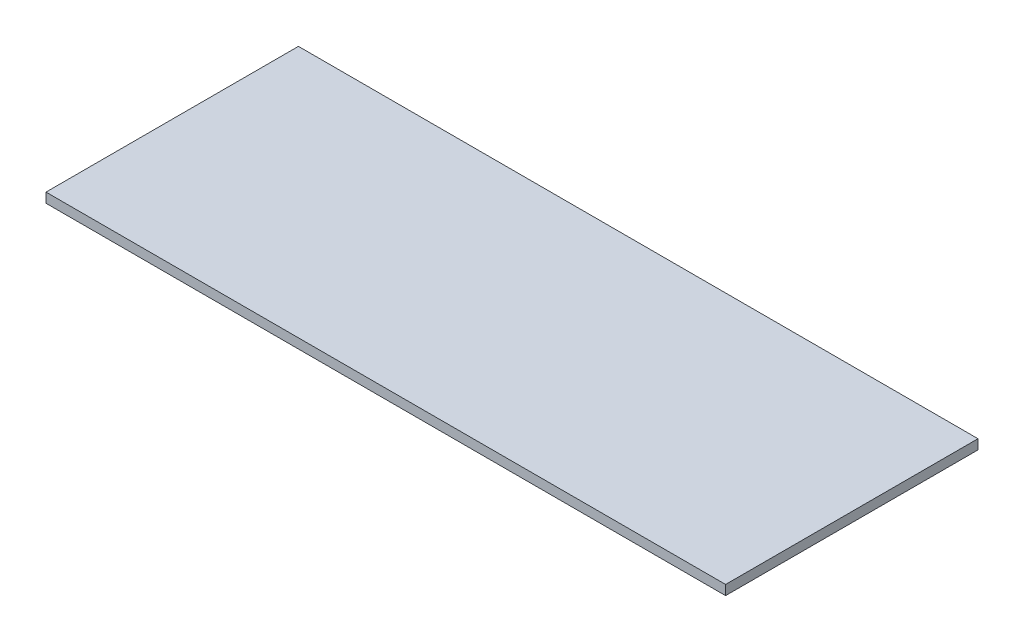
ISO-10303-21;
HEADER;
FILE_DESCRIPTION(('STEP AP214'),'2;1');
FILE_NAME('part.step','',(''),(''),'','','');
FILE_SCHEMA(('AUTOMOTIVE_DESIGN { 1 0 10303 214 1 1 1 1 }'));
ENDSEC;
DATA;
#1=APPLICATION_CONTEXT('core data for automotive mechanical design processes');
#2=APPLICATION_PROTOCOL_DEFINITION('international standard','automotive_design',2000,#1);
#3=PRODUCT_CONTEXT('',#1,'mechanical');
#4=PRODUCT('Part','Part','',(#3));
#5=PRODUCT_RELATED_PRODUCT_CATEGORY('part','',(#4));
#6=PRODUCT_DEFINITION_FORMATION('','',#4);
#7=PRODUCT_DEFINITION_CONTEXT('part definition',#1,'design');
#8=PRODUCT_DEFINITION('design','',#6,#7);
#9=PRODUCT_DEFINITION_SHAPE('','',#8);
#10=(LENGTH_UNIT() NAMED_UNIT(*) SI_UNIT(.MILLI.,.METRE.));
#11=(NAMED_UNIT(*) PLANE_ANGLE_UNIT() SI_UNIT($,.RADIAN.));
#12=(NAMED_UNIT(*) SI_UNIT($,.STERADIAN.) SOLID_ANGLE_UNIT());
#13=UNCERTAINTY_MEASURE_WITH_UNIT(LENGTH_MEASURE(1.E-05),#10,'distance_accuracy_value','');
#14=(GEOMETRIC_REPRESENTATION_CONTEXT(3) GLOBAL_UNCERTAINTY_ASSIGNED_CONTEXT((#13)) GLOBAL_UNIT_ASSIGNED_CONTEXT((#10,
#11,#12)) REPRESENTATION_CONTEXT('',''));
#15=CARTESIAN_POINT('',(0.,0.,0.));
#16=DIRECTION('',(0.,0.,1.));
#17=DIRECTION('',(1.,0.,0.));
#18=AXIS2_PLACEMENT_3D('',#15,#16,#17);
#19=CARTESIAN_POINT('',(175.,5.,-65.));
#20=DIRECTION('',(-1.,0.,0.));
#21=DIRECTION('',(0.,0.,1.));
#22=AXIS2_PLACEMENT_3D('',#19,#20,#21);
#23=PLANE('',#22);
#24=DIRECTION('',(0.,0.,-1.));
#25=VECTOR('',#24,1.);
#26=CARTESIAN_POINT('',(175.,0.,-65.));
#27=LINE('',#26,#25);
#28=CARTESIAN_POINT('',(175.,0.,65.));
#29=VERTEX_POINT('',#28);
#30=CARTESIAN_POINT('',(175.,0.,-65.));
#31=VERTEX_POINT('',#30);
#32=EDGE_CURVE('E96',#29,#31,#27,.T.);
#33=ORIENTED_EDGE('',*,*,#32,.T.);
#34=DIRECTION('',(0.,-1.,0.));
#35=VECTOR('',#34,1.);
#36=CARTESIAN_POINT('',(175.,5.,-65.));
#37=LINE('',#36,#35);
#38=CARTESIAN_POINT('',(175.,5.,-65.));
#39=VERTEX_POINT('',#38);
#40=EDGE_CURVE('E11',#39,#31,#37,.T.);
#41=ORIENTED_EDGE('',*,*,#40,.F.);
#42=DIRECTION('',(0.,0.,-1.));
#43=VECTOR('',#42,1.);
#44=CARTESIAN_POINT('',(175.,5.,-65.));
#45=LINE('',#44,#43);
#46=CARTESIAN_POINT('',(175.,5.,65.));
#47=VERTEX_POINT('',#46);
#48=EDGE_CURVE('E84',#47,#39,#45,.T.);
#49=ORIENTED_EDGE('',*,*,#48,.F.);
#50=DIRECTION('',(0.,-1.,0.));
#51=VECTOR('',#50,1.);
#52=CARTESIAN_POINT('',(175.,5.,65.));
#53=LINE('',#52,#51);
#54=EDGE_CURVE('E92',#47,#29,#53,.T.);
#55=ORIENTED_EDGE('',*,*,#54,.T.);
#56=EDGE_LOOP('',(#33,#41,#49,#55));
#57=FACE_BOUND('',#56,.T.);
#58=ADVANCED_FACE('F33',(#57),#23,.F.);
#59=CARTESIAN_POINT('',(-175.,5.,-65.));
#60=DIRECTION('',(0.,0.,1.));
#61=DIRECTION('',(1.,0.,0.));
#62=AXIS2_PLACEMENT_3D('',#59,#60,#61);
#63=PLANE('',#62);
#64=DIRECTION('',(-1.,0.,0.));
#65=VECTOR('',#64,1.);
#66=CARTESIAN_POINT('',(-175.,0.,-65.));
#67=LINE('',#66,#65);
#68=CARTESIAN_POINT('',(-175.,0.,-65.));
#69=VERTEX_POINT('',#68);
#70=EDGE_CURVE('E88',#31,#69,#67,.T.);
#71=ORIENTED_EDGE('',*,*,#70,.T.);
#72=DIRECTION('',(0.,-1.,0.));
#73=VECTOR('',#72,1.);
#74=CARTESIAN_POINT('',(-175.,5.,-65.));
#75=LINE('',#74,#73);
#76=CARTESIAN_POINT('',(-175.,5.,-65.));
#77=VERTEX_POINT('',#76);
#78=EDGE_CURVE('E41',#77,#69,#75,.T.);
#79=ORIENTED_EDGE('',*,*,#78,.F.);
#80=DIRECTION('',(-1.,0.,0.));
#81=VECTOR('',#80,1.);
#82=CARTESIAN_POINT('',(-175.,5.,-65.));
#83=LINE('',#82,#81);
#84=EDGE_CURVE('E79',#39,#77,#83,.T.);
#85=ORIENTED_EDGE('',*,*,#84,.F.);
#86=ORIENTED_EDGE('',*,*,#40,.T.);
#87=EDGE_LOOP('',(#71,#79,#85,#86));
#88=FACE_BOUND('',#87,.T.);
#89=ADVANCED_FACE('F87',(#88),#63,.F.);
#90=CARTESIAN_POINT('',(-175.,5.,-65.));
#91=DIRECTION('',(1.,0.,0.));
#92=DIRECTION('',(0.,0.,-1.));
#93=AXIS2_PLACEMENT_3D('',#90,#91,#92);
#94=PLANE('',#93);
#95=DIRECTION('',(0.,0.,1.));
#96=VECTOR('',#95,1.);
#97=CARTESIAN_POINT('',(-175.,0.,-65.));
#98=LINE('',#97,#96);
#99=CARTESIAN_POINT('',(-175.,0.,65.));
#100=VERTEX_POINT('',#99);
#101=EDGE_CURVE('E66',#69,#100,#98,.T.);
#102=ORIENTED_EDGE('',*,*,#101,.T.);
#103=DIRECTION('',(0.,-1.,0.));
#104=VECTOR('',#103,1.);
#105=CARTESIAN_POINT('',(-175.,5.,65.));
#106=LINE('',#105,#104);
#107=CARTESIAN_POINT('',(-175.,5.,65.));
#108=VERTEX_POINT('',#107);
#109=EDGE_CURVE('E89',#108,#100,#106,.T.);
#110=ORIENTED_EDGE('',*,*,#109,.F.);
#111=DIRECTION('',(0.,0.,1.));
#112=VECTOR('',#111,1.);
#113=CARTESIAN_POINT('',(-175.,5.,-65.));
#114=LINE('',#113,#112);
#115=EDGE_CURVE('E82',#77,#108,#114,.T.);
#116=ORIENTED_EDGE('',*,*,#115,.F.);
#117=ORIENTED_EDGE('',*,*,#78,.T.);
#118=EDGE_LOOP('',(#102,#110,#116,#117));
#119=FACE_BOUND('',#118,.T.);
#120=ADVANCED_FACE('F90',(#119),#94,.F.);
#121=CARTESIAN_POINT('',(-175.,5.,65.));
#122=DIRECTION('',(0.,0.,-1.));
#123=DIRECTION('',(-1.,0.,0.));
#124=AXIS2_PLACEMENT_3D('',#121,#122,#123);
#125=PLANE('',#124);
#126=DIRECTION('',(1.,0.,0.));
#127=VECTOR('',#126,1.);
#128=CARTESIAN_POINT('',(-175.,0.,65.));
#129=LINE('',#128,#127);
#130=EDGE_CURVE('E72',#100,#29,#129,.T.);
#131=ORIENTED_EDGE('',*,*,#130,.T.);
#132=ORIENTED_EDGE('',*,*,#54,.F.);
#133=DIRECTION('',(1.,0.,0.));
#134=VECTOR('',#133,1.);
#135=CARTESIAN_POINT('',(-175.,5.,65.));
#136=LINE('',#135,#134);
#137=EDGE_CURVE('E49',#108,#47,#136,.T.);
#138=ORIENTED_EDGE('',*,*,#137,.F.);
#139=ORIENTED_EDGE('',*,*,#109,.T.);
#140=EDGE_LOOP('',(#131,#132,#138,#139));
#141=FACE_BOUND('',#140,.T.);
#142=ADVANCED_FACE('F103',(#141),#125,.F.);
#143=CARTESIAN_POINT('',(0.,5.,0.));
#144=DIRECTION('',(0.,1.,0.));
#145=DIRECTION('',(0.,0.,1.));
#146=AXIS2_PLACEMENT_3D('',#143,#144,#145);
#147=PLANE('',#146);
#148=ORIENTED_EDGE('',*,*,#48,.T.);
#149=ORIENTED_EDGE('',*,*,#84,.T.);
#150=ORIENTED_EDGE('',*,*,#115,.T.);
#151=ORIENTED_EDGE('',*,*,#137,.T.);
#152=EDGE_LOOP('',(#148,#149,#150,#151));
#153=FACE_BOUND('',#152,.T.);
#154=ADVANCED_FACE('F80',(#153),#147,.T.);
#155=CARTESIAN_POINT('',(0.,0.,0.));
#156=DIRECTION('',(0.,1.,0.));
#157=DIRECTION('',(0.,0.,1.));
#158=AXIS2_PLACEMENT_3D('',#155,#156,#157);
#159=PLANE('',#158);
#160=ORIENTED_EDGE('',*,*,#32,.F.);
#161=ORIENTED_EDGE('',*,*,#130,.F.);
#162=ORIENTED_EDGE('',*,*,#101,.F.);
#163=ORIENTED_EDGE('',*,*,#70,.F.);
#164=EDGE_LOOP('',(#160,#161,#162,#163));
#165=FACE_BOUND('',#164,.T.);
#166=ADVANCED_FACE('F106',(#165),#159,.F.);
#167=CLOSED_SHELL('',(#58,#89,#120,#142,#154,#166));
#168=MANIFOLD_SOLID_BREP('B2',#167);
#169=ADVANCED_BREP_SHAPE_REPRESENTATION('',(#18,#168),#14);
#170=SHAPE_DEFINITION_REPRESENTATION(#9,#169);
ENDSEC;
END-ISO-10303-21;
